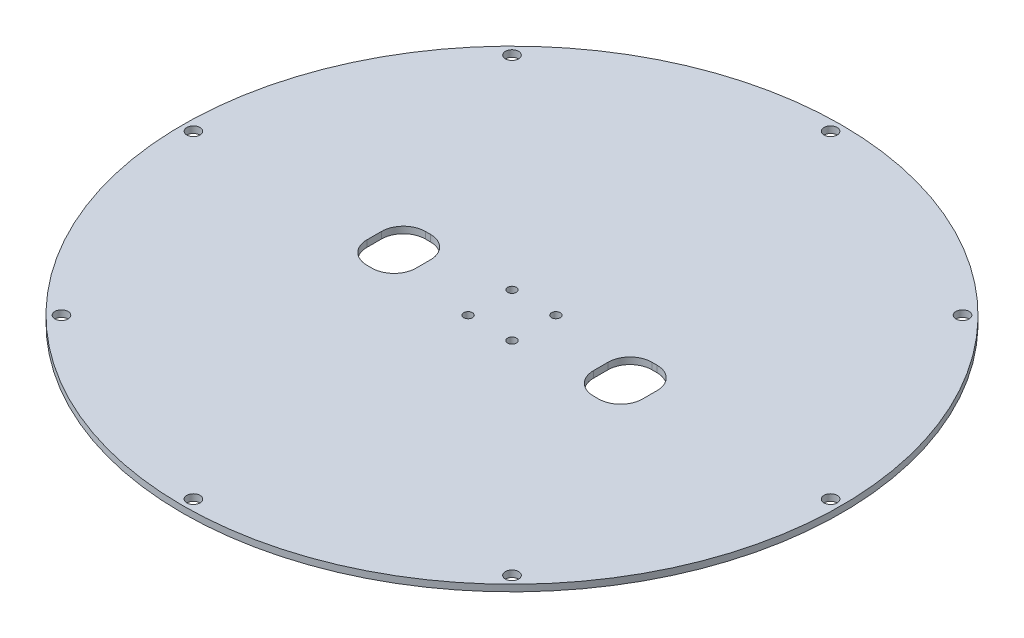
ISO-10303-21;
HEADER;
FILE_DESCRIPTION(('STEP AP214'),'2;1');
FILE_NAME('part.step','',(''),(''),'','','');
FILE_SCHEMA(('AUTOMOTIVE_DESIGN { 1 0 10303 214 1 1 1 1 }'));
ENDSEC;
DATA;
#1=APPLICATION_CONTEXT('core data for automotive mechanical design processes');
#2=APPLICATION_PROTOCOL_DEFINITION('international standard','automotive_design',2000,#1);
#3=PRODUCT_CONTEXT('',#1,'mechanical');
#4=PRODUCT('Part','Part','',(#3));
#5=PRODUCT_RELATED_PRODUCT_CATEGORY('part','',(#4));
#6=PRODUCT_DEFINITION_FORMATION('','',#4);
#7=PRODUCT_DEFINITION_CONTEXT('part definition',#1,'design');
#8=PRODUCT_DEFINITION('design','',#6,#7);
#9=PRODUCT_DEFINITION_SHAPE('','',#8);
#10=(LENGTH_UNIT() NAMED_UNIT(*) SI_UNIT(.MILLI.,.METRE.));
#11=(NAMED_UNIT(*) PLANE_ANGLE_UNIT() SI_UNIT($,.RADIAN.));
#12=(NAMED_UNIT(*) SI_UNIT($,.STERADIAN.) SOLID_ANGLE_UNIT());
#13=UNCERTAINTY_MEASURE_WITH_UNIT(LENGTH_MEASURE(1.E-05),#10,'distance_accuracy_value','');
#14=(GEOMETRIC_REPRESENTATION_CONTEXT(3) GLOBAL_UNCERTAINTY_ASSIGNED_CONTEXT((#13)) GLOBAL_UNIT_ASSIGNED_CONTEXT((#10,
#11,#12)) REPRESENTATION_CONTEXT('',''));
#15=CARTESIAN_POINT('',(0.,0.,0.));
#16=DIRECTION('',(0.,0.,1.));
#17=DIRECTION('',(1.,0.,0.));
#18=AXIS2_PLACEMENT_3D('',#15,#16,#17);
#19=CARTESIAN_POINT('',(50.3861191899613,3.,-3.31196564068166));
#20=DIRECTION('',(0.,1.,0.));
#21=DIRECTION('',(0.,0.,1.));
#22=AXIS2_PLACEMENT_3D('',#19,#20,#21);
#23=CYLINDRICAL_SURFACE('',#22,10.);
#24=DIRECTION('',(0.,-1.,0.));
#25=VECTOR('',#24,1.);
#26=CARTESIAN_POINT('',(50.3861191899613,3.,-13.3119656406817));
#27=LINE('',#26,#25);
#28=CARTESIAN_POINT('',(50.3861191899613,3.,-13.3119656406817));
#29=VERTEX_POINT('',#28);
#30=CARTESIAN_POINT('',(50.3861191899613,0.,-13.3119656406817));
#31=VERTEX_POINT('',#30);
#32=EDGE_CURVE('E320',#29,#31,#27,.T.);
#33=ORIENTED_EDGE('',*,*,#32,.F.);
#34=CARTESIAN_POINT('',(50.3861191899613,3.,-3.31196564068166));
#35=DIRECTION('',(0.,1.,0.));
#36=DIRECTION('',(0.,0.,1.));
#37=AXIS2_PLACEMENT_3D('',#34,#35,#36);
#38=CIRCLE('',#37,10.);
#39=CARTESIAN_POINT('',(40.3861191899613,3.,-3.31196564068166));
#40=VERTEX_POINT('',#39);
#41=EDGE_CURVE('E42',#29,#40,#38,.T.);
#42=ORIENTED_EDGE('',*,*,#41,.T.);
#43=DIRECTION('',(0.,-1.,0.));
#44=VECTOR('',#43,1.);
#45=CARTESIAN_POINT('',(40.3861191899613,3.,-3.31196564068166));
#46=LINE('',#45,#44);
#47=CARTESIAN_POINT('',(40.3861191899613,0.,-3.31196564068166));
#48=VERTEX_POINT('',#47);
#49=EDGE_CURVE('E323',#48,#40,#46,.F.);
#50=ORIENTED_EDGE('',*,*,#49,.F.);
#51=CARTESIAN_POINT('',(50.3861191899613,0.,-3.31196564068166));
#52=DIRECTION('',(0.,1.,0.));
#53=DIRECTION('',(0.,0.,1.));
#54=AXIS2_PLACEMENT_3D('',#51,#52,#53);
#55=CIRCLE('',#54,10.);
#56=EDGE_CURVE('E11',#48,#31,#55,.F.);
#57=ORIENTED_EDGE('',*,*,#56,.T.);
#58=EDGE_LOOP('',(#33,#42,#50,#57));
#59=FACE_BOUND('',#58,.T.);
#60=ADVANCED_FACE('F35',(#59),#23,.F.);
#61=CARTESIAN_POINT('',(52.7322415460342,3.,3.31196564068163));
#62=DIRECTION('',(0.,-1.,0.));
#63=DIRECTION('',(0.,0.,-1.));
#64=AXIS2_PLACEMENT_3D('',#61,#62,#63);
#65=CYLINDRICAL_SURFACE('',#64,10.);
#66=DIRECTION('',(0.,1.,0.));
#67=VECTOR('',#66,1.);
#68=CARTESIAN_POINT('',(62.7322415460342,3.,3.31196564068163));
#69=LINE('',#68,#67);
#70=CARTESIAN_POINT('',(62.7322415460342,0.,3.31196564068163));
#71=VERTEX_POINT('',#70);
#72=CARTESIAN_POINT('',(62.7322415460342,3.,3.31196564068163));
#73=VERTEX_POINT('',#72);
#74=EDGE_CURVE('E310',#71,#73,#69,.T.);
#75=ORIENTED_EDGE('',*,*,#74,.F.);
#76=CARTESIAN_POINT('',(52.7322415460342,0.,3.31196564068163));
#77=DIRECTION('',(0.,1.,0.));
#78=DIRECTION('',(0.,0.,1.));
#79=AXIS2_PLACEMENT_3D('',#76,#77,#78);
#80=CIRCLE('',#79,10.);
#81=CARTESIAN_POINT('',(52.7322415460342,0.,13.3119656406816));
#82=VERTEX_POINT('',#81);
#83=EDGE_CURVE('E316',#71,#82,#80,.F.);
#84=ORIENTED_EDGE('',*,*,#83,.T.);
#85=DIRECTION('',(0.,1.,0.));
#86=VECTOR('',#85,1.);
#87=CARTESIAN_POINT('',(52.7322415460342,3.,13.3119656406816));
#88=LINE('',#87,#86);
#89=CARTESIAN_POINT('',(52.7322415460342,3.,13.3119656406816));
#90=VERTEX_POINT('',#89);
#91=EDGE_CURVE('E313',#90,#82,#88,.F.);
#92=ORIENTED_EDGE('',*,*,#91,.F.);
#93=CARTESIAN_POINT('',(52.7322415460342,3.,3.31196564068163));
#94=DIRECTION('',(0.,1.,0.));
#95=DIRECTION('',(0.,0.,1.));
#96=AXIS2_PLACEMENT_3D('',#93,#94,#95);
#97=CIRCLE('',#96,10.);
#98=EDGE_CURVE('E318',#90,#73,#97,.T.);
#99=ORIENTED_EDGE('',*,*,#98,.T.);
#100=EDGE_LOOP('',(#75,#84,#92,#99));
#101=FACE_BOUND('',#100,.T.);
#102=ADVANCED_FACE('F397',(#101),#65,.F.);
#103=CARTESIAN_POINT('',(-52.7322415460342,3.,3.31196564068163));
#104=DIRECTION('',(0.,1.,0.));
#105=DIRECTION('',(0.,0.,1.));
#106=AXIS2_PLACEMENT_3D('',#103,#104,#105);
#107=CYLINDRICAL_SURFACE('',#106,10.);
#108=DIRECTION('',(0.,-1.,0.));
#109=VECTOR('',#108,1.);
#110=CARTESIAN_POINT('',(-62.7322415460342,3.,3.31196564068163));
#111=LINE('',#110,#109);
#112=CARTESIAN_POINT('',(-62.7322415460342,3.,3.31196564068163));
#113=VERTEX_POINT('',#112);
#114=CARTESIAN_POINT('',(-62.7322415460342,0.,3.31196564068163));
#115=VERTEX_POINT('',#114);
#116=EDGE_CURVE('E170',#113,#115,#111,.T.);
#117=ORIENTED_EDGE('',*,*,#116,.F.);
#118=CARTESIAN_POINT('',(-52.7322415460342,3.,3.31196564068163));
#119=DIRECTION('',(0.,1.,0.));
#120=DIRECTION('',(0.,0.,1.));
#121=AXIS2_PLACEMENT_3D('',#118,#119,#120);
#122=CIRCLE('',#121,10.);
#123=CARTESIAN_POINT('',(-52.7322415460342,3.,13.3119656406816));
#124=VERTEX_POINT('',#123);
#125=EDGE_CURVE('E306',#113,#124,#122,.T.);
#126=ORIENTED_EDGE('',*,*,#125,.T.);
#127=DIRECTION('',(0.,-1.,0.));
#128=VECTOR('',#127,1.);
#129=CARTESIAN_POINT('',(-52.7322415460342,3.,13.3119656406816));
#130=LINE('',#129,#128);
#131=CARTESIAN_POINT('',(-52.7322415460342,0.,13.3119656406816));
#132=VERTEX_POINT('',#131);
#133=EDGE_CURVE('E303',#132,#124,#130,.F.);
#134=ORIENTED_EDGE('',*,*,#133,.F.);
#135=CARTESIAN_POINT('',(-52.7322415460342,0.,3.31196564068163));
#136=DIRECTION('',(0.,1.,0.));
#137=DIRECTION('',(0.,0.,1.));
#138=AXIS2_PLACEMENT_3D('',#135,#136,#137);
#139=CIRCLE('',#138,10.);
#140=EDGE_CURVE('E308',#132,#115,#139,.F.);
#141=ORIENTED_EDGE('',*,*,#140,.T.);
#142=EDGE_LOOP('',(#117,#126,#134,#141));
#143=FACE_BOUND('',#142,.T.);
#144=ADVANCED_FACE('F378',(#143),#107,.F.);
#145=CARTESIAN_POINT('',(-50.3861191899613,3.,-3.31196564068166));
#146=DIRECTION('',(0.,-1.,0.));
#147=DIRECTION('',(0.,0.,-1.));
#148=AXIS2_PLACEMENT_3D('',#145,#146,#147);
#149=CYLINDRICAL_SURFACE('',#148,10.);
#150=DIRECTION('',(0.,1.,0.));
#151=VECTOR('',#150,1.);
#152=CARTESIAN_POINT('',(-50.3861191899613,3.,-13.3119656406817));
#153=LINE('',#152,#151);
#154=CARTESIAN_POINT('',(-50.3861191899613,0.,-13.3119656406817));
#155=VERTEX_POINT('',#154);
#156=CARTESIAN_POINT('',(-50.3861191899613,3.,-13.3119656406817));
#157=VERTEX_POINT('',#156);
#158=EDGE_CURVE('E292',#155,#157,#153,.T.);
#159=ORIENTED_EDGE('',*,*,#158,.F.);
#160=CARTESIAN_POINT('',(-50.3861191899613,0.,-3.31196564068166));
#161=DIRECTION('',(0.,1.,0.));
#162=DIRECTION('',(0.,0.,1.));
#163=AXIS2_PLACEMENT_3D('',#160,#161,#162);
#164=CIRCLE('',#163,10.);
#165=CARTESIAN_POINT('',(-40.3861191899613,0.,-3.31196564068166));
#166=VERTEX_POINT('',#165);
#167=EDGE_CURVE('E298',#155,#166,#164,.F.);
#168=ORIENTED_EDGE('',*,*,#167,.T.);
#169=DIRECTION('',(0.,1.,0.));
#170=VECTOR('',#169,1.);
#171=CARTESIAN_POINT('',(-40.3861191899613,3.,-3.31196564068166));
#172=LINE('',#171,#170);
#173=CARTESIAN_POINT('',(-40.3861191899613,3.,-3.31196564068166));
#174=VERTEX_POINT('',#173);
#175=EDGE_CURVE('E295',#174,#166,#172,.F.);
#176=ORIENTED_EDGE('',*,*,#175,.F.);
#177=CARTESIAN_POINT('',(-50.3861191899613,3.,-3.31196564068166));
#178=DIRECTION('',(0.,1.,0.));
#179=DIRECTION('',(0.,0.,1.));
#180=AXIS2_PLACEMENT_3D('',#177,#178,#179);
#181=CIRCLE('',#180,10.);
#182=EDGE_CURVE('E300',#174,#157,#181,.T.);
#183=ORIENTED_EDGE('',*,*,#182,.T.);
#184=EDGE_LOOP('',(#159,#168,#176,#183));
#185=FACE_BOUND('',#184,.T.);
#186=ADVANCED_FACE('F369',(#185),#149,.F.);
#187=CARTESIAN_POINT('',(52.7322415460342,3.,-3.31196564068166));
#188=DIRECTION('',(0.,-1.,0.));
#189=DIRECTION('',(0.,0.,-1.));
#190=AXIS2_PLACEMENT_3D('',#187,#188,#189);
#191=CYLINDRICAL_SURFACE('',#190,10.);
#192=DIRECTION('',(0.,1.,0.));
#193=VECTOR('',#192,1.);
#194=CARTESIAN_POINT('',(52.7322415460342,3.,-13.3119656406817));
#195=LINE('',#194,#193);
#196=CARTESIAN_POINT('',(52.7322415460342,0.,-13.3119656406817));
#197=VERTEX_POINT('',#196);
#198=CARTESIAN_POINT('',(52.7322415460342,3.,-13.3119656406817));
#199=VERTEX_POINT('',#198);
#200=EDGE_CURVE('E281',#197,#199,#195,.T.);
#201=ORIENTED_EDGE('',*,*,#200,.F.);
#202=CARTESIAN_POINT('',(52.7322415460342,0.,-3.31196564068166));
#203=DIRECTION('',(0.,1.,0.));
#204=DIRECTION('',(0.,0.,1.));
#205=AXIS2_PLACEMENT_3D('',#202,#203,#204);
#206=CIRCLE('',#205,10.);
#207=CARTESIAN_POINT('',(62.7322415460342,0.,-3.31196564068166));
#208=VERTEX_POINT('',#207);
#209=EDGE_CURVE('E287',#197,#208,#206,.F.);
#210=ORIENTED_EDGE('',*,*,#209,.T.);
#211=DIRECTION('',(0.,1.,0.));
#212=VECTOR('',#211,1.);
#213=CARTESIAN_POINT('',(62.7322415460342,3.,-3.31196564068166));
#214=LINE('',#213,#212);
#215=CARTESIAN_POINT('',(62.7322415460342,3.,-3.31196564068166));
#216=VERTEX_POINT('',#215);
#217=EDGE_CURVE('E284',#216,#208,#214,.F.);
#218=ORIENTED_EDGE('',*,*,#217,.F.);
#219=CARTESIAN_POINT('',(52.7322415460342,3.,-3.31196564068166));
#220=DIRECTION('',(0.,1.,0.));
#221=DIRECTION('',(0.,0.,1.));
#222=AXIS2_PLACEMENT_3D('',#219,#220,#221);
#223=CIRCLE('',#222,10.);
#224=EDGE_CURVE('E290',#216,#199,#223,.T.);
#225=ORIENTED_EDGE('',*,*,#224,.T.);
#226=EDGE_LOOP('',(#201,#210,#218,#225));
#227=FACE_BOUND('',#226,.T.);
#228=ADVANCED_FACE('F409',(#227),#191,.F.);
#229=CARTESIAN_POINT('',(50.3861191899613,3.,3.31196564068163));
#230=DIRECTION('',(0.,1.,0.));
#231=DIRECTION('',(0.,0.,1.));
#232=AXIS2_PLACEMENT_3D('',#229,#230,#231);
#233=CYLINDRICAL_SURFACE('',#232,10.);
#234=DIRECTION('',(0.,-1.,0.));
#235=VECTOR('',#234,1.);
#236=CARTESIAN_POINT('',(40.3861191899613,3.,3.31196564068163));
#237=LINE('',#236,#235);
#238=CARTESIAN_POINT('',(40.3861191899613,3.,3.31196564068163));
#239=VERTEX_POINT('',#238);
#240=CARTESIAN_POINT('',(40.3861191899613,0.,3.31196564068163));
#241=VERTEX_POINT('',#240);
#242=EDGE_CURVE('E270',#239,#241,#237,.T.);
#243=ORIENTED_EDGE('',*,*,#242,.F.);
#244=CARTESIAN_POINT('',(50.3861191899613,3.,3.31196564068163));
#245=DIRECTION('',(0.,1.,0.));
#246=DIRECTION('',(0.,0.,1.));
#247=AXIS2_PLACEMENT_3D('',#244,#245,#246);
#248=CIRCLE('',#247,10.);
#249=CARTESIAN_POINT('',(50.3861191899613,3.,13.3119656406816));
#250=VERTEX_POINT('',#249);
#251=EDGE_CURVE('E276',#239,#250,#248,.T.);
#252=ORIENTED_EDGE('',*,*,#251,.T.);
#253=DIRECTION('',(0.,-1.,0.));
#254=VECTOR('',#253,1.);
#255=CARTESIAN_POINT('',(50.3861191899613,3.,13.3119656406816));
#256=LINE('',#255,#254);
#257=CARTESIAN_POINT('',(50.3861191899613,0.,13.3119656406816));
#258=VERTEX_POINT('',#257);
#259=EDGE_CURVE('E273',#258,#250,#256,.F.);
#260=ORIENTED_EDGE('',*,*,#259,.F.);
#261=CARTESIAN_POINT('',(50.3861191899613,0.,3.31196564068163));
#262=DIRECTION('',(0.,1.,0.));
#263=DIRECTION('',(0.,0.,1.));
#264=AXIS2_PLACEMENT_3D('',#261,#262,#263);
#265=CIRCLE('',#264,10.);
#266=EDGE_CURVE('E278',#258,#241,#265,.F.);
#267=ORIENTED_EDGE('',*,*,#266,.T.);
#268=EDGE_LOOP('',(#243,#252,#260,#267));
#269=FACE_BOUND('',#268,.T.);
#270=ADVANCED_FACE('F418',(#269),#233,.F.);
#271=CARTESIAN_POINT('',(-50.3861191899613,3.,3.31196564068163));
#272=DIRECTION('',(0.,-1.,0.));
#273=DIRECTION('',(0.,0.,-1.));
#274=AXIS2_PLACEMENT_3D('',#271,#272,#273);
#275=CYLINDRICAL_SURFACE('',#274,10.);
#276=DIRECTION('',(0.,1.,0.));
#277=VECTOR('',#276,1.);
#278=CARTESIAN_POINT('',(-40.3861191899613,3.,3.31196564068163));
#279=LINE('',#278,#277);
#280=CARTESIAN_POINT('',(-40.3861191899613,0.,3.31196564068163));
#281=VERTEX_POINT('',#280);
#282=CARTESIAN_POINT('',(-40.3861191899613,3.,3.31196564068163));
#283=VERTEX_POINT('',#282);
#284=EDGE_CURVE('E259',#281,#283,#279,.T.);
#285=ORIENTED_EDGE('',*,*,#284,.F.);
#286=CARTESIAN_POINT('',(-50.3861191899613,0.,3.31196564068163));
#287=DIRECTION('',(0.,1.,0.));
#288=DIRECTION('',(0.,0.,1.));
#289=AXIS2_PLACEMENT_3D('',#286,#287,#288);
#290=CIRCLE('',#289,10.);
#291=CARTESIAN_POINT('',(-50.3861191899613,0.,13.3119656406816));
#292=VERTEX_POINT('',#291);
#293=EDGE_CURVE('E265',#281,#292,#290,.F.);
#294=ORIENTED_EDGE('',*,*,#293,.T.);
#295=DIRECTION('',(0.,1.,0.));
#296=VECTOR('',#295,1.);
#297=CARTESIAN_POINT('',(-50.3861191899613,3.,13.3119656406816));
#298=LINE('',#297,#296);
#299=CARTESIAN_POINT('',(-50.3861191899613,3.,13.3119656406816));
#300=VERTEX_POINT('',#299);
#301=EDGE_CURVE('E262',#300,#292,#298,.F.);
#302=ORIENTED_EDGE('',*,*,#301,.F.);
#303=CARTESIAN_POINT('',(-50.3861191899613,3.,3.31196564068163));
#304=DIRECTION('',(0.,1.,0.));
#305=DIRECTION('',(0.,0.,1.));
#306=AXIS2_PLACEMENT_3D('',#303,#304,#305);
#307=CIRCLE('',#306,10.);
#308=EDGE_CURVE('E268',#300,#283,#307,.T.);
#309=ORIENTED_EDGE('',*,*,#308,.T.);
#310=EDGE_LOOP('',(#285,#294,#302,#309));
#311=FACE_BOUND('',#310,.T.);
#312=ADVANCED_FACE('F383',(#311),#275,.F.);
#313=CARTESIAN_POINT('',(-52.7322415460342,3.,-3.31196564068166));
#314=DIRECTION('',(0.,-1.,0.));
#315=DIRECTION('',(0.,0.,-1.));
#316=AXIS2_PLACEMENT_3D('',#313,#314,#315);
#317=CYLINDRICAL_SURFACE('',#316,10.);
#318=DIRECTION('',(0.,1.,0.));
#319=VECTOR('',#318,1.);
#320=CARTESIAN_POINT('',(-62.7322415460342,3.,-3.31196564068166));
#321=LINE('',#320,#319);
#322=CARTESIAN_POINT('',(-62.7322415460342,0.,-3.31196564068166));
#323=VERTEX_POINT('',#322);
#324=CARTESIAN_POINT('',(-62.7322415460342,3.,-3.31196564068166));
#325=VERTEX_POINT('',#324);
#326=EDGE_CURVE('E159',#323,#325,#321,.T.);
#327=ORIENTED_EDGE('',*,*,#326,.F.);
#328=CARTESIAN_POINT('',(-52.7322415460342,0.,-3.31196564068166));
#329=DIRECTION('',(0.,1.,0.));
#330=DIRECTION('',(0.,0.,1.));
#331=AXIS2_PLACEMENT_3D('',#328,#329,#330);
#332=CIRCLE('',#331,10.);
#333=CARTESIAN_POINT('',(-52.7322415460342,0.,-13.3119656406817));
#334=VERTEX_POINT('',#333);
#335=EDGE_CURVE('E144',#323,#334,#332,.F.);
#336=ORIENTED_EDGE('',*,*,#335,.T.);
#337=DIRECTION('',(0.,1.,0.));
#338=VECTOR('',#337,1.);
#339=CARTESIAN_POINT('',(-52.7322415460342,3.,-13.3119656406817));
#340=LINE('',#339,#338);
#341=CARTESIAN_POINT('',(-52.7322415460342,3.,-13.3119656406817));
#342=VERTEX_POINT('',#341);
#343=EDGE_CURVE('E156',#342,#334,#340,.F.);
#344=ORIENTED_EDGE('',*,*,#343,.F.);
#345=CARTESIAN_POINT('',(-52.7322415460342,3.,-3.31196564068166));
#346=DIRECTION('',(0.,1.,0.));
#347=DIRECTION('',(0.,0.,1.));
#348=AXIS2_PLACEMENT_3D('',#345,#346,#347);
#349=CIRCLE('',#348,10.);
#350=EDGE_CURVE('E155',#342,#325,#349,.T.);
#351=ORIENTED_EDGE('',*,*,#350,.T.);
#352=EDGE_LOOP('',(#327,#336,#344,#351));
#353=FACE_BOUND('',#352,.T.);
#354=ADVANCED_FACE('F160',(#353),#317,.F.);
#355=CARTESIAN_POINT('',(0.,3.,0.));
#356=DIRECTION('',(0.,1.,0.));
#357=DIRECTION('',(0.,0.,1.));
#358=AXIS2_PLACEMENT_3D('',#355,#356,#357);
#359=PLANE('',#358);
#360=CARTESIAN_POINT('',(-10.,3.,-10.));
#361=DIRECTION('',(0.,1.,0.));
#362=DIRECTION('',(0.,0.,-1.));
#363=AXIS2_PLACEMENT_3D('',#360,#361,#362);
#364=CIRCLE('',#363,2.);
#365=CARTESIAN_POINT('',(-10.,3.,-12.));
#366=VERTEX_POINT('',#365);
#367=EDGE_CURVE('E187',#366,#366,#364,.T.);
#368=ORIENTED_EDGE('',*,*,#367,.F.);
#369=EDGE_LOOP('',(#368));
#370=FACE_BOUND('',#369,.T.);
#371=CARTESIAN_POINT('',(10.,3.,-10.));
#372=DIRECTION('',(0.,1.,0.));
#373=DIRECTION('',(0.,0.,1.));
#374=AXIS2_PLACEMENT_3D('',#371,#372,#373);
#375=CIRCLE('',#374,2.);
#376=CARTESIAN_POINT('',(10.,3.,-8.));
#377=VERTEX_POINT('',#376);
#378=EDGE_CURVE('E199',#377,#377,#375,.T.);
#379=ORIENTED_EDGE('',*,*,#378,.F.);
#380=EDGE_LOOP('',(#379));
#381=FACE_BOUND('',#380,.T.);
#382=CARTESIAN_POINT('',(-102.530483272049,3.,102.530483272049));
#383=DIRECTION('',(0.,1.,0.));
#384=DIRECTION('',(0.,0.,1.));
#385=AXIS2_PLACEMENT_3D('',#382,#383,#384);
#386=CIRCLE('',#385,3.00000000000001);
#387=CARTESIAN_POINT('',(-102.530483272049,3.,105.530483272049));
#388=VERTEX_POINT('',#387);
#389=EDGE_CURVE('E211',#388,#388,#386,.T.);
#390=ORIENTED_EDGE('',*,*,#389,.F.);
#391=EDGE_LOOP('',(#390));
#392=FACE_BOUND('',#391,.T.);
#393=CARTESIAN_POINT('',(102.53048327205,3.,-102.530483272049));
#394=DIRECTION('',(0.,1.,0.));
#395=DIRECTION('',(0.,0.,1.));
#396=AXIS2_PLACEMENT_3D('',#393,#394,#395);
#397=CIRCLE('',#396,2.99999999999992);
#398=CARTESIAN_POINT('',(102.53048327205,3.,-99.5304832720493));
#399=VERTEX_POINT('',#398);
#400=EDGE_CURVE('E223',#399,#399,#397,.T.);
#401=ORIENTED_EDGE('',*,*,#400,.F.);
#402=EDGE_LOOP('',(#401));
#403=FACE_BOUND('',#402,.T.);
#404=CARTESIAN_POINT('',(-145.,3.,0.));
#405=DIRECTION('',(0.,1.,0.));
#406=DIRECTION('',(0.,0.,-1.));
#407=AXIS2_PLACEMENT_3D('',#404,#405,#406);
#408=CIRCLE('',#407,2.99999999999999);
#409=CARTESIAN_POINT('',(-145.,3.,-2.99999999999997));
#410=VERTEX_POINT('',#409);
#411=EDGE_CURVE('E235',#410,#410,#408,.T.);
#412=ORIENTED_EDGE('',*,*,#411,.F.);
#413=EDGE_LOOP('',(#412));
#414=FACE_BOUND('',#413,.T.);
#415=CARTESIAN_POINT('',(0.,3.,-145.));
#416=DIRECTION('',(0.,1.,0.));
#417=DIRECTION('',(0.,0.,1.));
#418=AXIS2_PLACEMENT_3D('',#415,#416,#417);
#419=CIRCLE('',#418,3.);
#420=CARTESIAN_POINT('',(0.,3.,-142.));
#421=VERTEX_POINT('',#420);
#422=EDGE_CURVE('E247',#421,#421,#419,.T.);
#423=ORIENTED_EDGE('',*,*,#422,.F.);
#424=EDGE_LOOP('',(#423));
#425=FACE_BOUND('',#424,.T.);
#426=CARTESIAN_POINT('',(0.,3.,0.));
#427=DIRECTION('',(0.,1.,0.));
#428=DIRECTION('',(0.,0.,1.));
#429=AXIS2_PLACEMENT_3D('',#426,#427,#428);
#430=CIRCLE('',#429,150.);
#431=CARTESIAN_POINT('',(0.,3.,150.));
#432=VERTEX_POINT('',#431);
#433=EDGE_CURVE('E165',#432,#432,#430,.T.);
#434=ORIENTED_EDGE('',*,*,#433,.T.);
#435=EDGE_LOOP('',(#434));
#436=FACE_BOUND('',#435,.T.);
#437=CARTESIAN_POINT('',(0.,3.,145.));
#438=DIRECTION('',(0.,1.,0.));
#439=DIRECTION('',(0.,0.,-1.));
#440=AXIS2_PLACEMENT_3D('',#437,#438,#439);
#441=CIRCLE('',#440,3.);
#442=CARTESIAN_POINT('',(0.,3.,142.));
#443=VERTEX_POINT('',#442);
#444=EDGE_CURVE('E241',#443,#443,#441,.T.);
#445=ORIENTED_EDGE('',*,*,#444,.F.);
#446=EDGE_LOOP('',(#445));
#447=FACE_BOUND('',#446,.T.);
#448=CARTESIAN_POINT('',(145.,3.,0.));
#449=DIRECTION('',(0.,1.,0.));
#450=DIRECTION('',(0.,0.,1.));
#451=AXIS2_PLACEMENT_3D('',#448,#449,#450);
#452=CIRCLE('',#451,2.99999999999999);
#453=CARTESIAN_POINT('',(145.,3.,3.00000000000002));
#454=VERTEX_POINT('',#453);
#455=EDGE_CURVE('E229',#454,#454,#452,.T.);
#456=ORIENTED_EDGE('',*,*,#455,.F.);
#457=EDGE_LOOP('',(#456));
#458=FACE_BOUND('',#457,.T.);
#459=CARTESIAN_POINT('',(102.530483272049,3.,102.530483272049));
#460=DIRECTION('',(0.,1.,0.));
#461=DIRECTION('',(0.,0.,-1.));
#462=AXIS2_PLACEMENT_3D('',#459,#460,#461);
#463=CIRCLE('',#462,3.00000000000001);
#464=CARTESIAN_POINT('',(102.530483272049,3.,99.5304832720493));
#465=VERTEX_POINT('',#464);
#466=EDGE_CURVE('E217',#465,#465,#463,.T.);
#467=ORIENTED_EDGE('',*,*,#466,.F.);
#468=EDGE_LOOP('',(#467));
#469=FACE_BOUND('',#468,.T.);
#470=CARTESIAN_POINT('',(-102.530483272049,3.,-102.530483272049));
#471=DIRECTION('',(0.,1.,0.));
#472=DIRECTION('',(0.,0.,-1.));
#473=AXIS2_PLACEMENT_3D('',#470,#471,#472);
#474=CIRCLE('',#473,3.00000000000001);
#475=CARTESIAN_POINT('',(-102.530483272049,3.,-105.530483272049));
#476=VERTEX_POINT('',#475);
#477=EDGE_CURVE('E205',#476,#476,#474,.T.);
#478=ORIENTED_EDGE('',*,*,#477,.F.);
#479=EDGE_LOOP('',(#478));
#480=FACE_BOUND('',#479,.T.);
#481=CARTESIAN_POINT('',(10.,3.,10.));
#482=DIRECTION('',(0.,1.,0.));
#483=DIRECTION('',(0.,0.,-1.));
#484=AXIS2_PLACEMENT_3D('',#481,#482,#483);
#485=CIRCLE('',#484,1.99999999999999);
#486=CARTESIAN_POINT('',(10.,3.,8.00000000000001));
#487=VERTEX_POINT('',#486);
#488=EDGE_CURVE('E193',#487,#487,#485,.T.);
#489=ORIENTED_EDGE('',*,*,#488,.F.);
#490=EDGE_LOOP('',(#489));
#491=FACE_BOUND('',#490,.T.);
#492=CARTESIAN_POINT('',(-10.,3.,10.));
#493=DIRECTION('',(0.,1.,0.));
#494=DIRECTION('',(0.,0.,1.));
#495=AXIS2_PLACEMENT_3D('',#492,#493,#494);
#496=CIRCLE('',#495,1.99999999999999);
#497=CARTESIAN_POINT('',(-10.,3.,12.));
#498=VERTEX_POINT('',#497);
#499=EDGE_CURVE('E179',#498,#498,#496,.T.);
#500=ORIENTED_EDGE('',*,*,#499,.F.);
#501=EDGE_LOOP('',(#500));
#502=FACE_BOUND('',#501,.T.);
#503=DIRECTION('',(-1.,0.,0.));
#504=VECTOR('',#503,1.);
#505=CARTESIAN_POINT('',(-62.7322415460342,3.,-13.3119656406817));
#506=LINE('',#505,#504);
#507=EDGE_CURVE('E356',#157,#342,#506,.T.);
#508=ORIENTED_EDGE('',*,*,#507,.F.);
#509=ORIENTED_EDGE('',*,*,#182,.F.);
#510=DIRECTION('',(0.,0.,-1.));
#511=VECTOR('',#510,1.);
#512=CARTESIAN_POINT('',(-40.3861191899613,3.,13.3119656406816));
#513=LINE('',#512,#511);
#514=EDGE_CURVE('E173',#283,#174,#513,.T.);
#515=ORIENTED_EDGE('',*,*,#514,.F.);
#516=ORIENTED_EDGE('',*,*,#308,.F.);
#517=DIRECTION('',(1.,0.,0.));
#518=VECTOR('',#517,1.);
#519=CARTESIAN_POINT('',(-62.7322415460342,3.,13.3119656406816));
#520=LINE('',#519,#518);
#521=EDGE_CURVE('E186',#124,#300,#520,.T.);
#522=ORIENTED_EDGE('',*,*,#521,.F.);
#523=ORIENTED_EDGE('',*,*,#125,.F.);
#524=DIRECTION('',(0.,0.,1.));
#525=VECTOR('',#524,1.);
#526=CARTESIAN_POINT('',(-62.7322415460342,3.,13.3119656406816));
#527=LINE('',#526,#525);
#528=EDGE_CURVE('E358',#325,#113,#527,.T.);
#529=ORIENTED_EDGE('',*,*,#528,.F.);
#530=ORIENTED_EDGE('',*,*,#350,.F.);
#531=EDGE_LOOP('',(#508,#509,#515,#516,#522,#523,#529,#530));
#532=FACE_BOUND('',#531,.T.);
#533=DIRECTION('',(-1.,0.,0.));
#534=VECTOR('',#533,1.);
#535=CARTESIAN_POINT('',(62.7322415460342,3.,-13.3119656406817));
#536=LINE('',#535,#534);
#537=EDGE_CURVE('E337',#199,#29,#536,.T.);
#538=ORIENTED_EDGE('',*,*,#537,.F.);
#539=ORIENTED_EDGE('',*,*,#224,.F.);
#540=DIRECTION('',(0.,0.,-1.));
#541=VECTOR('',#540,1.);
#542=CARTESIAN_POINT('',(62.7322415460342,3.,13.3119656406816));
#543=LINE('',#542,#541);
#544=EDGE_CURVE('E342',#73,#216,#543,.T.);
#545=ORIENTED_EDGE('',*,*,#544,.F.);
#546=ORIENTED_EDGE('',*,*,#98,.F.);
#547=DIRECTION('',(1.,0.,0.));
#548=VECTOR('',#547,1.);
#549=CARTESIAN_POINT('',(62.7322415460342,3.,13.3119656406816));
#550=LINE('',#549,#548);
#551=EDGE_CURVE('E336',#250,#90,#550,.T.);
#552=ORIENTED_EDGE('',*,*,#551,.F.);
#553=ORIENTED_EDGE('',*,*,#251,.F.);
#554=DIRECTION('',(0.,0.,1.));
#555=VECTOR('',#554,1.);
#556=CARTESIAN_POINT('',(40.3861191899613,3.,13.3119656406816));
#557=LINE('',#556,#555);
#558=EDGE_CURVE('E328',#40,#239,#557,.T.);
#559=ORIENTED_EDGE('',*,*,#558,.F.);
#560=ORIENTED_EDGE('',*,*,#41,.F.);
#561=EDGE_LOOP('',(#538,#539,#545,#546,#552,#553,#559,#560));
#562=FACE_BOUND('',#561,.T.);
#563=ADVANCED_FACE('F333',(#370,#381,#392,#403,#414,#425,#436,#447,#458,#469,#480,#491,#502,
#532,#562),#359,.T.);
#564=CARTESIAN_POINT('',(0.,0.,0.));
#565=DIRECTION('',(0.,1.,0.));
#566=DIRECTION('',(0.,0.,1.));
#567=AXIS2_PLACEMENT_3D('',#564,#565,#566);
#568=PLANE('',#567);
#569=ORIENTED_EDGE('',*,*,#56,.F.);
#570=DIRECTION('',(0.,0.,1.));
#571=VECTOR('',#570,1.);
#572=CARTESIAN_POINT('',(40.3861191899613,0.,13.3119656406816));
#573=LINE('',#572,#571);
#574=EDGE_CURVE('E330',#48,#241,#573,.T.);
#575=ORIENTED_EDGE('',*,*,#574,.T.);
#576=ORIENTED_EDGE('',*,*,#266,.F.);
#577=DIRECTION('',(1.,0.,0.));
#578=VECTOR('',#577,1.);
#579=CARTESIAN_POINT('',(62.7322415460342,0.,13.3119656406816));
#580=LINE('',#579,#578);
#581=EDGE_CURVE('E351',#258,#82,#580,.T.);
#582=ORIENTED_EDGE('',*,*,#581,.T.);
#583=ORIENTED_EDGE('',*,*,#83,.F.);
#584=DIRECTION('',(0.,0.,-1.));
#585=VECTOR('',#584,1.);
#586=CARTESIAN_POINT('',(62.7322415460342,0.,13.3119656406816));
#587=LINE('',#586,#585);
#588=EDGE_CURVE('E346',#71,#208,#587,.T.);
#589=ORIENTED_EDGE('',*,*,#588,.T.);
#590=ORIENTED_EDGE('',*,*,#209,.F.);
#591=DIRECTION('',(-1.,0.,0.));
#592=VECTOR('',#591,1.);
#593=CARTESIAN_POINT('',(62.7322415460342,0.,-13.3119656406817));
#594=LINE('',#593,#592);
#595=EDGE_CURVE('E348',#197,#31,#594,.T.);
#596=ORIENTED_EDGE('',*,*,#595,.T.);
#597=EDGE_LOOP('',(#569,#575,#576,#582,#583,#589,#590,#596));
#598=FACE_BOUND('',#597,.T.);
#599=ORIENTED_EDGE('',*,*,#140,.F.);
#600=DIRECTION('',(1.,0.,0.));
#601=VECTOR('',#600,1.);
#602=CARTESIAN_POINT('',(-62.7322415460342,0.,13.3119656406816));
#603=LINE('',#602,#601);
#604=EDGE_CURVE('E171',#132,#292,#603,.T.);
#605=ORIENTED_EDGE('',*,*,#604,.T.);
#606=ORIENTED_EDGE('',*,*,#293,.F.);
#607=DIRECTION('',(0.,0.,-1.));
#608=VECTOR('',#607,1.);
#609=CARTESIAN_POINT('',(-40.3861191899613,0.,13.3119656406816));
#610=LINE('',#609,#608);
#611=EDGE_CURVE('E175',#281,#166,#610,.T.);
#612=ORIENTED_EDGE('',*,*,#611,.T.);
#613=ORIENTED_EDGE('',*,*,#167,.F.);
#614=DIRECTION('',(-1.,0.,0.));
#615=VECTOR('',#614,1.);
#616=CARTESIAN_POINT('',(-62.7322415460342,0.,-13.3119656406817));
#617=LINE('',#616,#615);
#618=EDGE_CURVE('E151',#155,#334,#617,.T.);
#619=ORIENTED_EDGE('',*,*,#618,.T.);
#620=ORIENTED_EDGE('',*,*,#335,.F.);
#621=DIRECTION('',(0.,0.,1.));
#622=VECTOR('',#621,1.);
#623=CARTESIAN_POINT('',(-62.7322415460342,0.,13.3119656406816));
#624=LINE('',#623,#622);
#625=EDGE_CURVE('E149',#323,#115,#624,.T.);
#626=ORIENTED_EDGE('',*,*,#625,.T.);
#627=EDGE_LOOP('',(#599,#605,#606,#612,#613,#619,#620,#626));
#628=FACE_BOUND('',#627,.T.);
#629=CARTESIAN_POINT('',(0.,0.,0.));
#630=DIRECTION('',(0.,1.,0.));
#631=DIRECTION('',(0.,0.,1.));
#632=AXIS2_PLACEMENT_3D('',#629,#630,#631);
#633=CIRCLE('',#632,150.);
#634=CARTESIAN_POINT('',(0.,0.,150.));
#635=VERTEX_POINT('',#634);
#636=EDGE_CURVE('E250',#635,#635,#633,.T.);
#637=ORIENTED_EDGE('',*,*,#636,.F.);
#638=EDGE_LOOP('',(#637));
#639=FACE_BOUND('',#638,.T.);
#640=CARTESIAN_POINT('',(0.,0.,-145.));
#641=DIRECTION('',(0.,1.,0.));
#642=DIRECTION('',(0.,0.,1.));
#643=AXIS2_PLACEMENT_3D('',#640,#641,#642);
#644=CIRCLE('',#643,3.);
#645=CARTESIAN_POINT('',(0.,0.,-142.));
#646=VERTEX_POINT('',#645);
#647=EDGE_CURVE('E244',#646,#646,#644,.T.);
#648=ORIENTED_EDGE('',*,*,#647,.T.);
#649=EDGE_LOOP('',(#648));
#650=FACE_BOUND('',#649,.T.);
#651=CARTESIAN_POINT('',(0.,0.,145.));
#652=DIRECTION('',(0.,1.,0.));
#653=DIRECTION('',(0.,0.,-1.));
#654=AXIS2_PLACEMENT_3D('',#651,#652,#653);
#655=CIRCLE('',#654,3.);
#656=CARTESIAN_POINT('',(0.,0.,142.));
#657=VERTEX_POINT('',#656);
#658=EDGE_CURVE('E238',#657,#657,#655,.T.);
#659=ORIENTED_EDGE('',*,*,#658,.T.);
#660=EDGE_LOOP('',(#659));
#661=FACE_BOUND('',#660,.T.);
#662=CARTESIAN_POINT('',(-145.,0.,0.));
#663=DIRECTION('',(0.,1.,0.));
#664=DIRECTION('',(0.,0.,-1.));
#665=AXIS2_PLACEMENT_3D('',#662,#663,#664);
#666=CIRCLE('',#665,2.99999999999999);
#667=CARTESIAN_POINT('',(-145.,0.,-2.99999999999997));
#668=VERTEX_POINT('',#667);
#669=EDGE_CURVE('E232',#668,#668,#666,.T.);
#670=ORIENTED_EDGE('',*,*,#669,.T.);
#671=EDGE_LOOP('',(#670));
#672=FACE_BOUND('',#671,.T.);
#673=CARTESIAN_POINT('',(145.,0.,0.));
#674=DIRECTION('',(0.,1.,0.));
#675=DIRECTION('',(0.,0.,1.));
#676=AXIS2_PLACEMENT_3D('',#673,#674,#675);
#677=CIRCLE('',#676,2.99999999999999);
#678=CARTESIAN_POINT('',(145.,0.,3.00000000000002));
#679=VERTEX_POINT('',#678);
#680=EDGE_CURVE('E226',#679,#679,#677,.T.);
#681=ORIENTED_EDGE('',*,*,#680,.T.);
#682=EDGE_LOOP('',(#681));
#683=FACE_BOUND('',#682,.T.);
#684=CARTESIAN_POINT('',(102.53048327205,0.,-102.530483272049));
#685=DIRECTION('',(0.,1.,0.));
#686=DIRECTION('',(0.,0.,1.));
#687=AXIS2_PLACEMENT_3D('',#684,#685,#686);
#688=CIRCLE('',#687,2.99999999999992);
#689=CARTESIAN_POINT('',(102.53048327205,0.,-99.5304832720493));
#690=VERTEX_POINT('',#689);
#691=EDGE_CURVE('E220',#690,#690,#688,.T.);
#692=ORIENTED_EDGE('',*,*,#691,.T.);
#693=EDGE_LOOP('',(#692));
#694=FACE_BOUND('',#693,.T.);
#695=CARTESIAN_POINT('',(102.530483272049,0.,102.530483272049));
#696=DIRECTION('',(0.,1.,0.));
#697=DIRECTION('',(0.,0.,-1.));
#698=AXIS2_PLACEMENT_3D('',#695,#696,#697);
#699=CIRCLE('',#698,3.00000000000001);
#700=CARTESIAN_POINT('',(102.530483272049,0.,99.5304832720493));
#701=VERTEX_POINT('',#700);
#702=EDGE_CURVE('E214',#701,#701,#699,.T.);
#703=ORIENTED_EDGE('',*,*,#702,.T.);
#704=EDGE_LOOP('',(#703));
#705=FACE_BOUND('',#704,.T.);
#706=CARTESIAN_POINT('',(-102.530483272049,0.,102.530483272049));
#707=DIRECTION('',(0.,1.,0.));
#708=DIRECTION('',(0.,0.,1.));
#709=AXIS2_PLACEMENT_3D('',#706,#707,#708);
#710=CIRCLE('',#709,3.00000000000001);
#711=CARTESIAN_POINT('',(-102.530483272049,0.,105.530483272049));
#712=VERTEX_POINT('',#711);
#713=EDGE_CURVE('E208',#712,#712,#710,.T.);
#714=ORIENTED_EDGE('',*,*,#713,.T.);
#715=EDGE_LOOP('',(#714));
#716=FACE_BOUND('',#715,.T.);
#717=CARTESIAN_POINT('',(-102.530483272049,0.,-102.530483272049));
#718=DIRECTION('',(0.,1.,0.));
#719=DIRECTION('',(0.,0.,-1.));
#720=AXIS2_PLACEMENT_3D('',#717,#718,#719);
#721=CIRCLE('',#720,3.00000000000001);
#722=CARTESIAN_POINT('',(-102.530483272049,0.,-105.530483272049));
#723=VERTEX_POINT('',#722);
#724=EDGE_CURVE('E202',#723,#723,#721,.T.);
#725=ORIENTED_EDGE('',*,*,#724,.T.);
#726=EDGE_LOOP('',(#725));
#727=FACE_BOUND('',#726,.T.);
#728=CARTESIAN_POINT('',(10.,0.,-10.));
#729=DIRECTION('',(0.,1.,0.));
#730=DIRECTION('',(0.,0.,1.));
#731=AXIS2_PLACEMENT_3D('',#728,#729,#730);
#732=CIRCLE('',#731,2.);
#733=CARTESIAN_POINT('',(10.,0.,-8.));
#734=VERTEX_POINT('',#733);
#735=EDGE_CURVE('E196',#734,#734,#732,.T.);
#736=ORIENTED_EDGE('',*,*,#735,.T.);
#737=EDGE_LOOP('',(#736));
#738=FACE_BOUND('',#737,.T.);
#739=CARTESIAN_POINT('',(10.,0.,10.));
#740=DIRECTION('',(0.,1.,0.));
#741=DIRECTION('',(0.,0.,-1.));
#742=AXIS2_PLACEMENT_3D('',#739,#740,#741);
#743=CIRCLE('',#742,1.99999999999999);
#744=CARTESIAN_POINT('',(10.,0.,8.00000000000001));
#745=VERTEX_POINT('',#744);
#746=EDGE_CURVE('E190',#745,#745,#743,.T.);
#747=ORIENTED_EDGE('',*,*,#746,.T.);
#748=EDGE_LOOP('',(#747));
#749=FACE_BOUND('',#748,.T.);
#750=CARTESIAN_POINT('',(-10.,0.,-10.));
#751=DIRECTION('',(0.,1.,0.));
#752=DIRECTION('',(0.,0.,-1.));
#753=AXIS2_PLACEMENT_3D('',#750,#751,#752);
#754=CIRCLE('',#753,2.);
#755=CARTESIAN_POINT('',(-10.,0.,-12.));
#756=VERTEX_POINT('',#755);
#757=EDGE_CURVE('E182',#756,#756,#754,.T.);
#758=ORIENTED_EDGE('',*,*,#757,.T.);
#759=EDGE_LOOP('',(#758));
#760=FACE_BOUND('',#759,.T.);
#761=CARTESIAN_POINT('',(-10.,0.,10.));
#762=DIRECTION('',(0.,1.,0.));
#763=DIRECTION('',(0.,0.,1.));
#764=AXIS2_PLACEMENT_3D('',#761,#762,#763);
#765=CIRCLE('',#764,1.99999999999999);
#766=CARTESIAN_POINT('',(-10.,0.,12.));
#767=VERTEX_POINT('',#766);
#768=EDGE_CURVE('E183',#767,#767,#765,.T.);
#769=ORIENTED_EDGE('',*,*,#768,.T.);
#770=EDGE_LOOP('',(#769));
#771=FACE_BOUND('',#770,.T.);
#772=ADVANCED_FACE('F146',(#598,#628,#639,#650,#661,#672,#683,#694,#705,#716,#727,#738,#749,
#760,#771),#568,.F.);
#773=CARTESIAN_POINT('',(0.,3.,0.));
#774=DIRECTION('',(0.,-1.,0.));
#775=DIRECTION('',(0.,0.,-1.));
#776=AXIS2_PLACEMENT_3D('',#773,#774,#775);
#777=CYLINDRICAL_SURFACE('',#776,150.);
#778=ORIENTED_EDGE('',*,*,#433,.F.);
#779=EDGE_LOOP('',(#778));
#780=FACE_BOUND('',#779,.T.);
#781=ORIENTED_EDGE('',*,*,#636,.T.);
#782=EDGE_LOOP('',(#781));
#783=FACE_BOUND('',#782,.T.);
#784=ADVANCED_FACE('F420',(#780,#783),#777,.T.);
#785=CARTESIAN_POINT('',(0.,3.,-145.));
#786=DIRECTION('',(0.,-1.,0.));
#787=DIRECTION('',(0.,0.,-1.));
#788=AXIS2_PLACEMENT_3D('',#785,#786,#787);
#789=CYLINDRICAL_SURFACE('',#788,3.);
#790=ORIENTED_EDGE('',*,*,#422,.T.);
#791=EDGE_LOOP('',(#790));
#792=FACE_BOUND('',#791,.T.);
#793=ORIENTED_EDGE('',*,*,#647,.F.);
#794=EDGE_LOOP('',(#793));
#795=FACE_BOUND('',#794,.T.);
#796=ADVANCED_FACE('F426',(#792,#795),#789,.F.);
#797=CARTESIAN_POINT('',(0.,3.,145.));
#798=DIRECTION('',(0.,-1.,0.));
#799=DIRECTION('',(0.,0.,-1.));
#800=AXIS2_PLACEMENT_3D('',#797,#798,#799);
#801=CYLINDRICAL_SURFACE('',#800,3.);
#802=ORIENTED_EDGE('',*,*,#444,.T.);
#803=EDGE_LOOP('',(#802));
#804=FACE_BOUND('',#803,.T.);
#805=ORIENTED_EDGE('',*,*,#658,.F.);
#806=EDGE_LOOP('',(#805));
#807=FACE_BOUND('',#806,.T.);
#808=ADVANCED_FACE('F616',(#804,#807),#801,.F.);
#809=CARTESIAN_POINT('',(-145.,3.,0.));
#810=DIRECTION('',(0.,-1.,0.));
#811=DIRECTION('',(0.,0.,-1.));
#812=AXIS2_PLACEMENT_3D('',#809,#810,#811);
#813=CYLINDRICAL_SURFACE('',#812,2.99999999999999);
#814=ORIENTED_EDGE('',*,*,#411,.T.);
#815=EDGE_LOOP('',(#814));
#816=FACE_BOUND('',#815,.T.);
#817=ORIENTED_EDGE('',*,*,#669,.F.);
#818=EDGE_LOOP('',(#817));
#819=FACE_BOUND('',#818,.T.);
#820=ADVANCED_FACE('F608',(#816,#819),#813,.F.);
#821=CARTESIAN_POINT('',(145.,3.,0.));
#822=DIRECTION('',(0.,-1.,0.));
#823=DIRECTION('',(0.,0.,-1.));
#824=AXIS2_PLACEMENT_3D('',#821,#822,#823);
#825=CYLINDRICAL_SURFACE('',#824,2.99999999999999);
#826=ORIENTED_EDGE('',*,*,#455,.T.);
#827=EDGE_LOOP('',(#826));
#828=FACE_BOUND('',#827,.T.);
#829=ORIENTED_EDGE('',*,*,#680,.F.);
#830=EDGE_LOOP('',(#829));
#831=FACE_BOUND('',#830,.T.);
#832=ADVANCED_FACE('F600',(#828,#831),#825,.F.);
#833=CARTESIAN_POINT('',(102.53048327205,3.,-102.530483272049));
#834=DIRECTION('',(0.,-1.,0.));
#835=DIRECTION('',(0.,0.,-1.));
#836=AXIS2_PLACEMENT_3D('',#833,#834,#835);
#837=CYLINDRICAL_SURFACE('',#836,2.99999999999992);
#838=ORIENTED_EDGE('',*,*,#400,.T.);
#839=EDGE_LOOP('',(#838));
#840=FACE_BOUND('',#839,.T.);
#841=ORIENTED_EDGE('',*,*,#691,.F.);
#842=EDGE_LOOP('',(#841));
#843=FACE_BOUND('',#842,.T.);
#844=ADVANCED_FACE('F592',(#840,#843),#837,.F.);
#845=CARTESIAN_POINT('',(102.530483272049,3.,102.530483272049));
#846=DIRECTION('',(0.,-1.,0.));
#847=DIRECTION('',(0.,0.,-1.));
#848=AXIS2_PLACEMENT_3D('',#845,#846,#847);
#849=CYLINDRICAL_SURFACE('',#848,3.00000000000001);
#850=ORIENTED_EDGE('',*,*,#466,.T.);
#851=EDGE_LOOP('',(#850));
#852=FACE_BOUND('',#851,.T.);
#853=ORIENTED_EDGE('',*,*,#702,.F.);
#854=EDGE_LOOP('',(#853));
#855=FACE_BOUND('',#854,.T.);
#856=ADVANCED_FACE('F584',(#852,#855),#849,.F.);
#857=CARTESIAN_POINT('',(-102.530483272049,3.,102.530483272049));
#858=DIRECTION('',(0.,-1.,0.));
#859=DIRECTION('',(0.,0.,-1.));
#860=AXIS2_PLACEMENT_3D('',#857,#858,#859);
#861=CYLINDRICAL_SURFACE('',#860,3.00000000000001);
#862=ORIENTED_EDGE('',*,*,#389,.T.);
#863=EDGE_LOOP('',(#862));
#864=FACE_BOUND('',#863,.T.);
#865=ORIENTED_EDGE('',*,*,#713,.F.);
#866=EDGE_LOOP('',(#865));
#867=FACE_BOUND('',#866,.T.);
#868=ADVANCED_FACE('F576',(#864,#867),#861,.F.);
#869=CARTESIAN_POINT('',(-102.530483272049,3.,-102.530483272049));
#870=DIRECTION('',(0.,-1.,0.));
#871=DIRECTION('',(0.,0.,-1.));
#872=AXIS2_PLACEMENT_3D('',#869,#870,#871);
#873=CYLINDRICAL_SURFACE('',#872,3.00000000000001);
#874=ORIENTED_EDGE('',*,*,#477,.T.);
#875=EDGE_LOOP('',(#874));
#876=FACE_BOUND('',#875,.T.);
#877=ORIENTED_EDGE('',*,*,#724,.F.);
#878=EDGE_LOOP('',(#877));
#879=FACE_BOUND('',#878,.T.);
#880=ADVANCED_FACE('F568',(#876,#879),#873,.F.);
#881=CARTESIAN_POINT('',(10.,3.,-10.));
#882=DIRECTION('',(0.,-1.,0.));
#883=DIRECTION('',(0.,0.,-1.));
#884=AXIS2_PLACEMENT_3D('',#881,#882,#883);
#885=CYLINDRICAL_SURFACE('',#884,2.);
#886=ORIENTED_EDGE('',*,*,#378,.T.);
#887=EDGE_LOOP('',(#886));
#888=FACE_BOUND('',#887,.T.);
#889=ORIENTED_EDGE('',*,*,#735,.F.);
#890=EDGE_LOOP('',(#889));
#891=FACE_BOUND('',#890,.T.);
#892=ADVANCED_FACE('F560',(#888,#891),#885,.F.);
#893=CARTESIAN_POINT('',(10.,3.,10.));
#894=DIRECTION('',(0.,-1.,0.));
#895=DIRECTION('',(0.,0.,-1.));
#896=AXIS2_PLACEMENT_3D('',#893,#894,#895);
#897=CYLINDRICAL_SURFACE('',#896,1.99999999999999);
#898=ORIENTED_EDGE('',*,*,#488,.T.);
#899=EDGE_LOOP('',(#898));
#900=FACE_BOUND('',#899,.T.);
#901=ORIENTED_EDGE('',*,*,#746,.F.);
#902=EDGE_LOOP('',(#901));
#903=FACE_BOUND('',#902,.T.);
#904=ADVANCED_FACE('F552',(#900,#903),#897,.F.);
#905=CARTESIAN_POINT('',(-10.,3.,-10.));
#906=DIRECTION('',(0.,-1.,0.));
#907=DIRECTION('',(0.,0.,-1.));
#908=AXIS2_PLACEMENT_3D('',#905,#906,#907);
#909=CYLINDRICAL_SURFACE('',#908,2.);
#910=ORIENTED_EDGE('',*,*,#367,.T.);
#911=EDGE_LOOP('',(#910));
#912=FACE_BOUND('',#911,.T.);
#913=ORIENTED_EDGE('',*,*,#757,.F.);
#914=EDGE_LOOP('',(#913));
#915=FACE_BOUND('',#914,.T.);
#916=ADVANCED_FACE('F544',(#912,#915),#909,.F.);
#917=CARTESIAN_POINT('',(-10.,3.,10.));
#918=DIRECTION('',(0.,-1.,0.));
#919=DIRECTION('',(0.,0.,-1.));
#920=AXIS2_PLACEMENT_3D('',#917,#918,#919);
#921=CYLINDRICAL_SURFACE('',#920,1.99999999999999);
#922=ORIENTED_EDGE('',*,*,#499,.T.);
#923=EDGE_LOOP('',(#922));
#924=FACE_BOUND('',#923,.T.);
#925=ORIENTED_EDGE('',*,*,#768,.F.);
#926=EDGE_LOOP('',(#925));
#927=FACE_BOUND('',#926,.T.);
#928=ADVANCED_FACE('F538',(#924,#927),#921,.F.);
#929=CARTESIAN_POINT('',(-40.3861191899613,3.,13.3119656406816));
#930=DIRECTION('',(-1.,0.,0.));
#931=DIRECTION('',(0.,0.,1.));
#932=AXIS2_PLACEMENT_3D('',#929,#930,#931);
#933=PLANE('',#932);
#934=ORIENTED_EDGE('',*,*,#514,.T.);
#935=ORIENTED_EDGE('',*,*,#175,.T.);
#936=ORIENTED_EDGE('',*,*,#611,.F.);
#937=ORIENTED_EDGE('',*,*,#284,.T.);
#938=EDGE_LOOP('',(#934,#935,#936,#937));
#939=FACE_BOUND('',#938,.T.);
#940=ADVANCED_FACE('F365',(#939),#933,.T.);
#941=CARTESIAN_POINT('',(-62.7322415460342,3.,-13.3119656406817));
#942=DIRECTION('',(0.,0.,1.));
#943=DIRECTION('',(1.,0.,0.));
#944=AXIS2_PLACEMENT_3D('',#941,#942,#943);
#945=PLANE('',#944);
#946=ORIENTED_EDGE('',*,*,#618,.F.);
#947=ORIENTED_EDGE('',*,*,#158,.T.);
#948=ORIENTED_EDGE('',*,*,#507,.T.);
#949=ORIENTED_EDGE('',*,*,#343,.T.);
#950=EDGE_LOOP('',(#946,#947,#948,#949));
#951=FACE_BOUND('',#950,.T.);
#952=ADVANCED_FACE('F372',(#951),#945,.T.);
#953=CARTESIAN_POINT('',(-62.7322415460342,3.,13.3119656406816));
#954=DIRECTION('',(1.,0.,0.));
#955=DIRECTION('',(0.,0.,-1.));
#956=AXIS2_PLACEMENT_3D('',#953,#954,#955);
#957=PLANE('',#956);
#958=ORIENTED_EDGE('',*,*,#528,.T.);
#959=ORIENTED_EDGE('',*,*,#116,.T.);
#960=ORIENTED_EDGE('',*,*,#625,.F.);
#961=ORIENTED_EDGE('',*,*,#326,.T.);
#962=EDGE_LOOP('',(#958,#959,#960,#961));
#963=FACE_BOUND('',#962,.T.);
#964=ADVANCED_FACE('F168',(#963),#957,.T.);
#965=CARTESIAN_POINT('',(-62.7322415460342,3.,13.3119656406816));
#966=DIRECTION('',(0.,0.,-1.));
#967=DIRECTION('',(-1.,0.,0.));
#968=AXIS2_PLACEMENT_3D('',#965,#966,#967);
#969=PLANE('',#968);
#970=ORIENTED_EDGE('',*,*,#604,.F.);
#971=ORIENTED_EDGE('',*,*,#133,.T.);
#972=ORIENTED_EDGE('',*,*,#521,.T.);
#973=ORIENTED_EDGE('',*,*,#301,.T.);
#974=EDGE_LOOP('',(#970,#971,#972,#973));
#975=FACE_BOUND('',#974,.T.);
#976=ADVANCED_FACE('F384',(#975),#969,.T.);
#977=CARTESIAN_POINT('',(62.7322415460342,3.,13.3119656406816));
#978=DIRECTION('',(-1.,0.,0.));
#979=DIRECTION('',(0.,0.,1.));
#980=AXIS2_PLACEMENT_3D('',#977,#978,#979);
#981=PLANE('',#980);
#982=ORIENTED_EDGE('',*,*,#588,.F.);
#983=ORIENTED_EDGE('',*,*,#74,.T.);
#984=ORIENTED_EDGE('',*,*,#544,.T.);
#985=ORIENTED_EDGE('',*,*,#217,.T.);
#986=EDGE_LOOP('',(#982,#983,#984,#985));
#987=FACE_BOUND('',#986,.T.);
#988=ADVANCED_FACE('F386',(#987),#981,.T.);
#989=CARTESIAN_POINT('',(62.7322415460342,3.,-13.3119656406817));
#990=DIRECTION('',(0.,0.,1.));
#991=DIRECTION('',(1.,0.,0.));
#992=AXIS2_PLACEMENT_3D('',#989,#990,#991);
#993=PLANE('',#992);
#994=ORIENTED_EDGE('',*,*,#537,.T.);
#995=ORIENTED_EDGE('',*,*,#32,.T.);
#996=ORIENTED_EDGE('',*,*,#595,.F.);
#997=ORIENTED_EDGE('',*,*,#200,.T.);
#998=EDGE_LOOP('',(#994,#995,#996,#997));
#999=FACE_BOUND('',#998,.T.);
#1000=ADVANCED_FACE('F392',(#999),#993,.T.);
#1001=CARTESIAN_POINT('',(40.3861191899613,3.,13.3119656406816));
#1002=DIRECTION('',(1.,0.,0.));
#1003=DIRECTION('',(0.,0.,-1.));
#1004=AXIS2_PLACEMENT_3D('',#1001,#1002,#1003);
#1005=PLANE('',#1004);
#1006=ORIENTED_EDGE('',*,*,#574,.F.);
#1007=ORIENTED_EDGE('',*,*,#49,.T.);
#1008=ORIENTED_EDGE('',*,*,#558,.T.);
#1009=ORIENTED_EDGE('',*,*,#242,.T.);
#1010=EDGE_LOOP('',(#1006,#1007,#1008,#1009));
#1011=FACE_BOUND('',#1010,.T.);
#1012=ADVANCED_FACE('F327',(#1011),#1005,.T.);
#1013=CARTESIAN_POINT('',(62.7322415460342,3.,13.3119656406816));
#1014=DIRECTION('',(0.,0.,-1.));
#1015=DIRECTION('',(-1.,0.,0.));
#1016=AXIS2_PLACEMENT_3D('',#1013,#1014,#1015);
#1017=PLANE('',#1016);
#1018=ORIENTED_EDGE('',*,*,#551,.T.);
#1019=ORIENTED_EDGE('',*,*,#91,.T.);
#1020=ORIENTED_EDGE('',*,*,#581,.F.);
#1021=ORIENTED_EDGE('',*,*,#259,.T.);
#1022=EDGE_LOOP('',(#1018,#1019,#1020,#1021));
#1023=FACE_BOUND('',#1022,.T.);
#1024=ADVANCED_FACE('F414',(#1023),#1017,.T.);
#1025=CLOSED_SHELL('',(#60,#102,#144,#186,#228,#270,#312,#354,#563,#772,#784,#796,#808,#820,
#832,#844,#856,#868,#880,#892,#904,#916,#928,#940,#952,#964,#976,#988,#1000,#1012,#1024));
#1026=MANIFOLD_SOLID_BREP('B2',#1025);
#1027=ADVANCED_BREP_SHAPE_REPRESENTATION('',(#18,#1026),#14);
#1028=SHAPE_DEFINITION_REPRESENTATION(#9,#1027);
ENDSEC;
END-ISO-10303-21;
